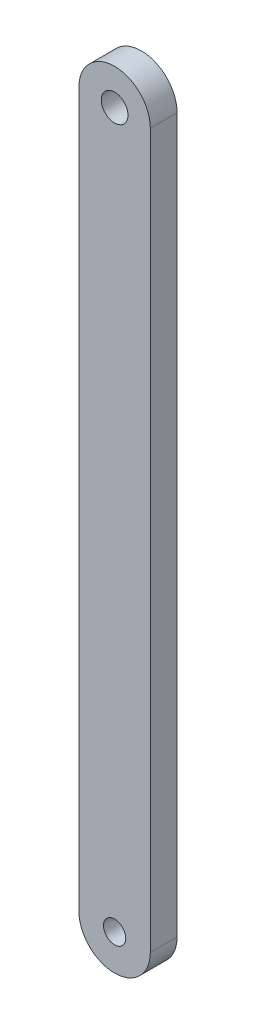
ISO-10303-21;
HEADER;
FILE_DESCRIPTION(('STEP AP214'),'2;1');
FILE_NAME('part.step','',(''),(''),'','','');
FILE_SCHEMA(('AUTOMOTIVE_DESIGN { 1 0 10303 214 1 1 1 1 }'));
ENDSEC;
DATA;
#1=APPLICATION_CONTEXT('core data for automotive mechanical design processes');
#2=APPLICATION_PROTOCOL_DEFINITION('international standard','automotive_design',2000,#1);
#3=PRODUCT_CONTEXT('',#1,'mechanical');
#4=PRODUCT('Part','Part','',(#3));
#5=PRODUCT_RELATED_PRODUCT_CATEGORY('part','',(#4));
#6=PRODUCT_DEFINITION_FORMATION('','',#4);
#7=PRODUCT_DEFINITION_CONTEXT('part definition',#1,'design');
#8=PRODUCT_DEFINITION('design','',#6,#7);
#9=PRODUCT_DEFINITION_SHAPE('','',#8);
#10=(LENGTH_UNIT() NAMED_UNIT(*) SI_UNIT(.MILLI.,.METRE.));
#11=(NAMED_UNIT(*) PLANE_ANGLE_UNIT() SI_UNIT($,.RADIAN.));
#12=(NAMED_UNIT(*) SI_UNIT($,.STERADIAN.) SOLID_ANGLE_UNIT());
#13=UNCERTAINTY_MEASURE_WITH_UNIT(LENGTH_MEASURE(1.E-05),#10,'distance_accuracy_value','');
#14=(GEOMETRIC_REPRESENTATION_CONTEXT(3) GLOBAL_UNCERTAINTY_ASSIGNED_CONTEXT((#13)) GLOBAL_UNIT_ASSIGNED_CONTEXT((#10,
#11,#12)) REPRESENTATION_CONTEXT('',''));
#15=CARTESIAN_POINT('',(0.,0.,0.));
#16=DIRECTION('',(0.,0.,1.));
#17=DIRECTION('',(1.,0.,0.));
#18=AXIS2_PLACEMENT_3D('',#15,#16,#17);
#19=CARTESIAN_POINT('',(28.3002000006253,85.000200000625,3.));
#20=DIRECTION('',(0.,0.,-1.));
#21=DIRECTION('',(-1.,0.,0.));
#22=AXIS2_PLACEMENT_3D('',#19,#20,#21);
#23=PLANE('',#22);
#24=CARTESIAN_POINT('',(28.3002000006253,85.000200000625,3.));
#25=DIRECTION('',(0.,0.,1.));
#26=DIRECTION('',(-1.,0.,0.));
#27=AXIS2_PLACEMENT_3D('',#24,#25,#26);
#28=CIRCLE('',#27,3.99990000062505);
#29=CARTESIAN_POINT('',(32.3001000000003,85.0001000000123,3.));
#30=VERTEX_POINT('',#29);
#31=CARTESIAN_POINT('',(24.3003000000003,85.000200000625,3.));
#32=VERTEX_POINT('',#31);
#33=EDGE_CURVE('E85',#30,#32,#28,.T.);
#34=ORIENTED_EDGE('',*,*,#33,.T.);
#35=DIRECTION('',(0.,-1.,0.));
#36=VECTOR('',#35,1.);
#37=CARTESIAN_POINT('',(24.3003000000003,85.000200000625,3.));
#38=LINE('',#37,#36);
#39=CARTESIAN_POINT('',(24.3003000000003,5.00004388012339,3.));
#40=VERTEX_POINT('',#39);
#41=EDGE_CURVE('E80',#32,#40,#38,.T.);
#42=ORIENTED_EDGE('',*,*,#41,.T.);
#43=CARTESIAN_POINT('',(28.3001999997295,5.00004388012339,3.));
#44=DIRECTION('',(0.,0.,1.));
#45=DIRECTION('',(1.,0.,0.));
#46=AXIS2_PLACEMENT_3D('',#43,#44,#45);
#47=CIRCLE('',#46,3.99989999972923);
#48=CARTESIAN_POINT('',(32.3000999994029,5.00002274841855,3.));
#49=VERTEX_POINT('',#48);
#50=EDGE_CURVE('E83',#40,#49,#47,.T.);
#51=ORIENTED_EDGE('',*,*,#50,.T.);
#52=DIRECTION('',(7.46754367221553E-12,1.,0.));
#53=VECTOR('',#52,1.);
#54=CARTESIAN_POINT('',(32.3000999994029,5.00002274841855,3.));
#55=LINE('',#54,#53);
#56=EDGE_CURVE('E50',#49,#30,#55,.T.);
#57=ORIENTED_EDGE('',*,*,#56,.T.);
#58=EDGE_LOOP('',(#34,#42,#51,#57));
#59=FACE_BOUND('',#58,.T.);
#60=CARTESIAN_POINT('',(28.3001999997295,5.00004388012339,3.));
#61=DIRECTION('',(0.,0.,1.));
#62=DIRECTION('',(1.,0.,0.));
#63=AXIS2_PLACEMENT_3D('',#60,#61,#62);
#64=CIRCLE('',#63,1.25);
#65=CARTESIAN_POINT('',(29.5501999997295,5.00004388012339,3.));
#66=VERTEX_POINT('',#65);
#67=EDGE_CURVE('E100',#66,#66,#64,.T.);
#68=ORIENTED_EDGE('',*,*,#67,.F.);
#69=EDGE_LOOP('',(#68));
#70=FACE_BOUND('',#69,.T.);
#71=CARTESIAN_POINT('',(28.3002000006253,85.000200000625,3.));
#72=DIRECTION('',(0.,0.,1.));
#73=DIRECTION('',(1.,0.,0.));
#74=AXIS2_PLACEMENT_3D('',#71,#72,#73);
#75=CIRCLE('',#74,1.5);
#76=CARTESIAN_POINT('',(29.8002000006253,85.000200000625,3.));
#77=VERTEX_POINT('',#76);
#78=EDGE_CURVE('E115',#77,#77,#75,.T.);
#79=ORIENTED_EDGE('',*,*,#78,.F.);
#80=EDGE_LOOP('',(#79));
#81=FACE_BOUND('',#80,.T.);
#82=ADVANCED_FACE('F33',(#59,#70,#81),#23,.F.);
#83=CARTESIAN_POINT('',(28.3002000006253,85.000200000625,0.));
#84=DIRECTION('',(0.,0.,-1.));
#85=DIRECTION('',(-1.,0.,0.));
#86=AXIS2_PLACEMENT_3D('',#83,#84,#85);
#87=PLANE('',#86);
#88=CARTESIAN_POINT('',(28.3001999997295,5.00004388012339,0.));
#89=DIRECTION('',(0.,0.,1.));
#90=DIRECTION('',(1.,0.,0.));
#91=AXIS2_PLACEMENT_3D('',#88,#89,#90);
#92=CIRCLE('',#91,1.25);
#93=CARTESIAN_POINT('',(29.5501999997295,5.00004388012339,0.));
#94=VERTEX_POINT('',#93);
#95=EDGE_CURVE('E112',#94,#94,#92,.T.);
#96=ORIENTED_EDGE('',*,*,#95,.T.);
#97=EDGE_LOOP('',(#96));
#98=FACE_BOUND('',#97,.T.);
#99=CARTESIAN_POINT('',(28.3002000006253,85.000200000625,0.));
#100=DIRECTION('',(0.,0.,1.));
#101=DIRECTION('',(-1.,0.,0.));
#102=AXIS2_PLACEMENT_3D('',#99,#100,#101);
#103=CIRCLE('',#102,3.99990000062505);
#104=CARTESIAN_POINT('',(32.3001000000003,85.0001000000123,0.));
#105=VERTEX_POINT('',#104);
#106=CARTESIAN_POINT('',(24.3003000000003,85.000200000625,0.));
#107=VERTEX_POINT('',#106);
#108=EDGE_CURVE('E97',#105,#107,#103,.T.);
#109=ORIENTED_EDGE('',*,*,#108,.F.);
#110=DIRECTION('',(7.46754367221553E-12,1.,0.));
#111=VECTOR('',#110,1.);
#112=CARTESIAN_POINT('',(32.3000999994029,5.00002274841855,0.));
#113=LINE('',#112,#111);
#114=CARTESIAN_POINT('',(32.3000999994029,5.00002274841855,0.));
#115=VERTEX_POINT('',#114);
#116=EDGE_CURVE('E73',#115,#105,#113,.T.);
#117=ORIENTED_EDGE('',*,*,#116,.F.);
#118=CARTESIAN_POINT('',(28.3001999997295,5.00004388012339,0.));
#119=DIRECTION('',(0.,0.,1.));
#120=DIRECTION('',(1.,0.,0.));
#121=AXIS2_PLACEMENT_3D('',#118,#119,#120);
#122=CIRCLE('',#121,3.99989999972923);
#123=CARTESIAN_POINT('',(24.3003000000003,5.00004388012339,0.));
#124=VERTEX_POINT('',#123);
#125=EDGE_CURVE('E67',#124,#115,#122,.T.);
#126=ORIENTED_EDGE('',*,*,#125,.F.);
#127=DIRECTION('',(0.,-1.,0.));
#128=VECTOR('',#127,1.);
#129=CARTESIAN_POINT('',(24.3003000000003,85.000200000625,0.));
#130=LINE('',#129,#128);
#131=EDGE_CURVE('E89',#107,#124,#130,.T.);
#132=ORIENTED_EDGE('',*,*,#131,.F.);
#133=EDGE_LOOP('',(#109,#117,#126,#132));
#134=FACE_BOUND('',#133,.T.);
#135=CARTESIAN_POINT('',(28.3002000006253,85.000200000625,0.));
#136=DIRECTION('',(0.,0.,1.));
#137=DIRECTION('',(1.,0.,0.));
#138=AXIS2_PLACEMENT_3D('',#135,#136,#137);
#139=CIRCLE('',#138,1.5);
#140=CARTESIAN_POINT('',(29.8002000006253,85.000200000625,0.));
#141=VERTEX_POINT('',#140);
#142=EDGE_CURVE('E118',#141,#141,#139,.T.);
#143=ORIENTED_EDGE('',*,*,#142,.T.);
#144=EDGE_LOOP('',(#143));
#145=FACE_BOUND('',#144,.T.);
#146=ADVANCED_FACE('F108',(#98,#134,#145),#87,.T.);
#147=CARTESIAN_POINT('',(28.3002000006253,85.000200000625,3.));
#148=DIRECTION('',(0.,0.,-1.));
#149=DIRECTION('',(-1.,0.,0.));
#150=AXIS2_PLACEMENT_3D('',#147,#148,#149);
#151=CYLINDRICAL_SURFACE('',#150,3.99990000062505);
#152=ORIENTED_EDGE('',*,*,#108,.T.);
#153=DIRECTION('',(0.,0.,-1.));
#154=VECTOR('',#153,1.);
#155=CARTESIAN_POINT('',(24.3003000000003,85.000200000625,3.));
#156=LINE('',#155,#154);
#157=EDGE_CURVE('E11',#32,#107,#156,.T.);
#158=ORIENTED_EDGE('',*,*,#157,.F.);
#159=ORIENTED_EDGE('',*,*,#33,.F.);
#160=DIRECTION('',(0.,0.,-1.));
#161=VECTOR('',#160,1.);
#162=CARTESIAN_POINT('',(32.3001000000003,85.0001000000123,3.));
#163=LINE('',#162,#161);
#164=EDGE_CURVE('E93',#30,#105,#163,.T.);
#165=ORIENTED_EDGE('',*,*,#164,.T.);
#166=EDGE_LOOP('',(#152,#158,#159,#165));
#167=FACE_BOUND('',#166,.T.);
#168=ADVANCED_FACE('F35',(#167),#151,.T.);
#169=CARTESIAN_POINT('',(24.3003000000003,85.000200000625,3.));
#170=DIRECTION('',(1.,0.,0.));
#171=DIRECTION('',(0.,1.,0.));
#172=AXIS2_PLACEMENT_3D('',#169,#170,#171);
#173=PLANE('',#172);
#174=ORIENTED_EDGE('',*,*,#131,.T.);
#175=DIRECTION('',(0.,0.,-1.));
#176=VECTOR('',#175,1.);
#177=CARTESIAN_POINT('',(24.3003000000003,5.00004388012339,3.));
#178=LINE('',#177,#176);
#179=EDGE_CURVE('E42',#40,#124,#178,.T.);
#180=ORIENTED_EDGE('',*,*,#179,.F.);
#181=ORIENTED_EDGE('',*,*,#41,.F.);
#182=ORIENTED_EDGE('',*,*,#157,.T.);
#183=EDGE_LOOP('',(#174,#180,#181,#182));
#184=FACE_BOUND('',#183,.T.);
#185=ADVANCED_FACE('F88',(#184),#173,.F.);
#186=CARTESIAN_POINT('',(28.3001999997295,5.00004388012339,3.));
#187=DIRECTION('',(0.,0.,-1.));
#188=DIRECTION('',(-1.,0.,0.));
#189=AXIS2_PLACEMENT_3D('',#186,#187,#188);
#190=CYLINDRICAL_SURFACE('',#189,3.99989999972923);
#191=ORIENTED_EDGE('',*,*,#125,.T.);
#192=DIRECTION('',(0.,0.,-1.));
#193=VECTOR('',#192,1.);
#194=CARTESIAN_POINT('',(32.3000999994029,5.00002274841855,3.));
#195=LINE('',#194,#193);
#196=EDGE_CURVE('E90',#49,#115,#195,.T.);
#197=ORIENTED_EDGE('',*,*,#196,.F.);
#198=ORIENTED_EDGE('',*,*,#50,.F.);
#199=ORIENTED_EDGE('',*,*,#179,.T.);
#200=EDGE_LOOP('',(#191,#197,#198,#199));
#201=FACE_BOUND('',#200,.T.);
#202=ADVANCED_FACE('F91',(#201),#190,.T.);
#203=CARTESIAN_POINT('',(32.3000999994029,5.00002274841855,3.));
#204=DIRECTION('',(-1.,7.46754367221553E-12,0.));
#205=DIRECTION('',(-7.46754367221553E-12,-1.,0.));
#206=AXIS2_PLACEMENT_3D('',#203,#204,#205);
#207=PLANE('',#206);
#208=ORIENTED_EDGE('',*,*,#116,.T.);
#209=ORIENTED_EDGE('',*,*,#164,.F.);
#210=ORIENTED_EDGE('',*,*,#56,.F.);
#211=ORIENTED_EDGE('',*,*,#196,.T.);
#212=EDGE_LOOP('',(#208,#209,#210,#211));
#213=FACE_BOUND('',#212,.T.);
#214=ADVANCED_FACE('F105',(#213),#207,.F.);
#215=CARTESIAN_POINT('',(28.3001999997295,5.00004388012339,3.));
#216=DIRECTION('',(0.,0.,-1.));
#217=DIRECTION('',(-1.,0.,0.));
#218=AXIS2_PLACEMENT_3D('',#215,#216,#217);
#219=CYLINDRICAL_SURFACE('',#218,1.25);
#220=ORIENTED_EDGE('',*,*,#67,.T.);
#221=EDGE_LOOP('',(#220));
#222=FACE_BOUND('',#221,.T.);
#223=ORIENTED_EDGE('',*,*,#95,.F.);
#224=EDGE_LOOP('',(#223));
#225=FACE_BOUND('',#224,.T.);
#226=ADVANCED_FACE('F135',(#222,#225),#219,.F.);
#227=CARTESIAN_POINT('',(28.3002000006253,85.000200000625,3.));
#228=DIRECTION('',(0.,0.,-1.));
#229=DIRECTION('',(-1.,0.,0.));
#230=AXIS2_PLACEMENT_3D('',#227,#228,#229);
#231=CYLINDRICAL_SURFACE('',#230,1.5);
#232=ORIENTED_EDGE('',*,*,#78,.T.);
#233=EDGE_LOOP('',(#232));
#234=FACE_BOUND('',#233,.T.);
#235=ORIENTED_EDGE('',*,*,#142,.F.);
#236=EDGE_LOOP('',(#235));
#237=FACE_BOUND('',#236,.T.);
#238=ADVANCED_FACE('F124',(#234,#237),#231,.F.);
#239=CLOSED_SHELL('',(#82,#146,#168,#185,#202,#214,#226,#238));
#240=MANIFOLD_SOLID_BREP('B2',#239);
#241=ADVANCED_BREP_SHAPE_REPRESENTATION('',(#18,#240),#14);
#242=SHAPE_DEFINITION_REPRESENTATION(#9,#241);
ENDSEC;
END-ISO-10303-21;
